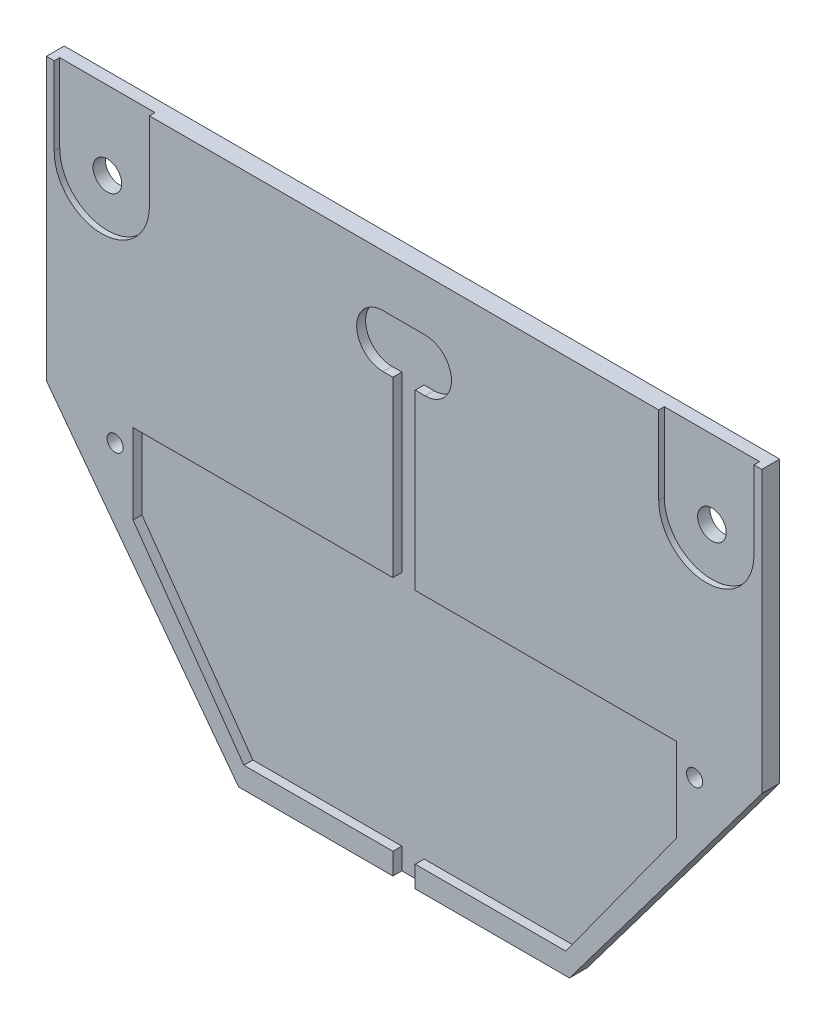
ISO-10303-21;
HEADER;
FILE_DESCRIPTION(('STEP AP214'),'2;1');
FILE_NAME('part.step','',(''),(''),'','','');
FILE_SCHEMA(('AUTOMOTIVE_DESIGN { 1 0 10303 214 1 1 1 1 }'));
ENDSEC;
DATA;
#1=APPLICATION_CONTEXT('core data for automotive mechanical design processes');
#2=APPLICATION_PROTOCOL_DEFINITION('international standard','automotive_design',2000,#1);
#3=PRODUCT_CONTEXT('',#1,'mechanical');
#4=PRODUCT('Part','Part','',(#3));
#5=PRODUCT_RELATED_PRODUCT_CATEGORY('part','',(#4));
#6=PRODUCT_DEFINITION_FORMATION('','',#4);
#7=PRODUCT_DEFINITION_CONTEXT('part definition',#1,'design');
#8=PRODUCT_DEFINITION('design','',#6,#7);
#9=PRODUCT_DEFINITION_SHAPE('','',#8);
#10=(LENGTH_UNIT() NAMED_UNIT(*) SI_UNIT(.MILLI.,.METRE.));
#11=(NAMED_UNIT(*) PLANE_ANGLE_UNIT() SI_UNIT($,.RADIAN.));
#12=(NAMED_UNIT(*) SI_UNIT($,.STERADIAN.) SOLID_ANGLE_UNIT());
#13=UNCERTAINTY_MEASURE_WITH_UNIT(LENGTH_MEASURE(1.E-05),#10,'distance_accuracy_value','');
#14=(GEOMETRIC_REPRESENTATION_CONTEXT(3) GLOBAL_UNCERTAINTY_ASSIGNED_CONTEXT((#13)) GLOBAL_UNIT_ASSIGNED_CONTEXT((#10,
#11,#12)) REPRESENTATION_CONTEXT('',''));
#15=CARTESIAN_POINT('',(0.,0.,0.));
#16=DIRECTION('',(0.,0.,1.));
#17=DIRECTION('',(1.,0.,0.));
#18=AXIS2_PLACEMENT_3D('',#15,#16,#17);
#19=CARTESIAN_POINT('',(101.6,152.4,-5.08));
#20=DIRECTION('',(0.,1.,0.));
#21=DIRECTION('',(0.,0.,1.));
#22=AXIS2_PLACEMENT_3D('',#19,#20,#21);
#23=PLANE('',#22);
#24=DIRECTION('',(1.,0.,0.));
#25=VECTOR('',#24,1.);
#26=CARTESIAN_POINT('',(-99.3775,152.4,-1.5875));
#27=LINE('',#26,#25);
#28=CARTESIAN_POINT('',(-99.3775,152.4,-1.5875));
#29=VERTEX_POINT('',#28);
#30=CARTESIAN_POINT('',(-72.3265,152.4,-1.5875));
#31=VERTEX_POINT('',#30);
#32=EDGE_CURVE('E260',#29,#31,#27,.T.);
#33=ORIENTED_EDGE('',*,*,#32,.T.);
#34=DIRECTION('',(0.,0.,1.));
#35=VECTOR('',#34,1.);
#36=CARTESIAN_POINT('',(-72.3265,152.4,-1.5875));
#37=LINE('',#36,#35);
#38=CARTESIAN_POINT('',(-72.3265,152.4,0.));
#39=VERTEX_POINT('',#38);
#40=EDGE_CURVE('E582',#31,#39,#37,.T.);
#41=ORIENTED_EDGE('',*,*,#40,.T.);
#42=DIRECTION('',(-1.,0.,0.));
#43=VECTOR('',#42,1.);
#44=CARTESIAN_POINT('',(101.6,152.4,0.));
#45=LINE('',#44,#43);
#46=CARTESIAN_POINT('',(72.3265,152.4,0.));
#47=VERTEX_POINT('',#46);
#48=EDGE_CURVE('E489',#47,#39,#45,.T.);
#49=ORIENTED_EDGE('',*,*,#48,.F.);
#50=DIRECTION('',(0.,0.,1.));
#51=VECTOR('',#50,1.);
#52=CARTESIAN_POINT('',(72.3265,152.4,-1.5875));
#53=LINE('',#52,#51);
#54=CARTESIAN_POINT('',(72.3265,152.4,-1.5875));
#55=VERTEX_POINT('',#54);
#56=EDGE_CURVE('E66',#55,#47,#53,.T.);
#57=ORIENTED_EDGE('',*,*,#56,.F.);
#58=DIRECTION('',(-1.,0.,0.));
#59=VECTOR('',#58,1.);
#60=CARTESIAN_POINT('',(99.3775,152.4,-1.5875));
#61=LINE('',#60,#59);
#62=CARTESIAN_POINT('',(99.3775,152.4,-1.5875));
#63=VERTEX_POINT('',#62);
#64=EDGE_CURVE('E280',#63,#55,#61,.T.);
#65=ORIENTED_EDGE('',*,*,#64,.F.);
#66=DIRECTION('',(0.,0.,1.));
#67=VECTOR('',#66,1.);
#68=CARTESIAN_POINT('',(99.3775,152.4,-1.5875));
#69=LINE('',#68,#67);
#70=CARTESIAN_POINT('',(99.3775,152.4,0.));
#71=VERTEX_POINT('',#70);
#72=EDGE_CURVE('E299',#63,#71,#69,.T.);
#73=ORIENTED_EDGE('',*,*,#72,.T.);
#74=CARTESIAN_POINT('',(101.6,152.4,0.));
#75=VERTEX_POINT('',#74);
#76=EDGE_CURVE('E485',#75,#71,#45,.T.);
#77=ORIENTED_EDGE('',*,*,#76,.F.);
#78=DIRECTION('',(0.,0.,1.));
#79=VECTOR('',#78,1.);
#80=CARTESIAN_POINT('',(101.6,152.4,-5.08));
#81=LINE('',#80,#79);
#82=CARTESIAN_POINT('',(101.6,152.4,-5.08));
#83=VERTEX_POINT('',#82);
#84=EDGE_CURVE('E497',#83,#75,#81,.T.);
#85=ORIENTED_EDGE('',*,*,#84,.F.);
#86=DIRECTION('',(-1.,0.,0.));
#87=VECTOR('',#86,1.);
#88=CARTESIAN_POINT('',(101.6,152.4,-5.08));
#89=LINE('',#88,#87);
#90=CARTESIAN_POINT('',(-101.6,152.4,-5.08));
#91=VERTEX_POINT('',#90);
#92=EDGE_CURVE('E466',#83,#91,#89,.T.);
#93=ORIENTED_EDGE('',*,*,#92,.T.);
#94=DIRECTION('',(0.,0.,1.));
#95=VECTOR('',#94,1.);
#96=CARTESIAN_POINT('',(-101.6,152.4,-5.08));
#97=LINE('',#96,#95);
#98=CARTESIAN_POINT('',(-101.6,152.4,0.));
#99=VERTEX_POINT('',#98);
#100=EDGE_CURVE('E495',#91,#99,#97,.T.);
#101=ORIENTED_EDGE('',*,*,#100,.T.);
#102=CARTESIAN_POINT('',(-99.3775,152.4,0.));
#103=VERTEX_POINT('',#102);
#104=EDGE_CURVE('E273',#103,#99,#45,.T.);
#105=ORIENTED_EDGE('',*,*,#104,.F.);
#106=DIRECTION('',(0.,0.,1.));
#107=VECTOR('',#106,1.);
#108=CARTESIAN_POINT('',(-99.3775,152.4,-1.5875));
#109=LINE('',#108,#107);
#110=EDGE_CURVE('E58',#29,#103,#109,.T.);
#111=ORIENTED_EDGE('',*,*,#110,.F.);
#112=EDGE_LOOP('',(#33,#41,#49,#57,#65,#73,#77,#85,#93,#101,#105,#111));
#113=FACE_BOUND('',#112,.T.);
#114=ADVANCED_FACE('F41',(#113),#23,.T.);
#115=CARTESIAN_POINT('',(0.,0.,0.));
#116=DIRECTION('',(0.,0.,1.));
#117=DIRECTION('',(1.,0.,0.));
#118=AXIS2_PLACEMENT_3D('',#115,#116,#117);
#119=PLANE('',#118);
#120=CARTESIAN_POINT('',(-82.0536493943438,67.056,0.));
#121=DIRECTION('',(0.,0.,1.));
#122=DIRECTION('',(1.,0.,0.));
#123=AXIS2_PLACEMENT_3D('',#120,#121,#122);
#124=CIRCLE('',#123,2.28599999999999);
#125=CARTESIAN_POINT('',(-79.7676493943438,67.056,0.));
#126=VERTEX_POINT('',#125);
#127=EDGE_CURVE('E311',#126,#126,#124,.T.);
#128=ORIENTED_EDGE('',*,*,#127,.F.);
#129=EDGE_LOOP('',(#128));
#130=FACE_BOUND('',#129,.T.);
#131=CARTESIAN_POINT('',(82.5187992899213,67.056,0.));
#132=DIRECTION('',(0.,0.,1.));
#133=DIRECTION('',(1.,0.,0.));
#134=AXIS2_PLACEMENT_3D('',#131,#132,#133);
#135=CIRCLE('',#134,2.28599999999999);
#136=CARTESIAN_POINT('',(84.8047992899212,67.056,0.));
#137=VERTEX_POINT('',#136);
#138=EDGE_CURVE('E312',#137,#137,#135,.T.);
#139=ORIENTED_EDGE('',*,*,#138,.F.);
#140=EDGE_LOOP('',(#139));
#141=FACE_BOUND('',#140,.T.);
#142=ORIENTED_EDGE('',*,*,#48,.T.);
#143=DIRECTION('',(0.,-1.,0.));
#144=VECTOR('',#143,1.);
#145=CARTESIAN_POINT('',(-72.3265,152.4,0.));
#146=LINE('',#145,#144);
#147=CARTESIAN_POINT('',(-72.3265,130.175,0.));
#148=VERTEX_POINT('',#147);
#149=EDGE_CURVE('E269',#39,#148,#146,.T.);
#150=ORIENTED_EDGE('',*,*,#149,.T.);
#151=CARTESIAN_POINT('',(-85.852,130.175,0.));
#152=DIRECTION('',(0.,0.,-1.));
#153=DIRECTION('',(-1.,0.,0.));
#154=AXIS2_PLACEMENT_3D('',#151,#152,#153);
#155=CIRCLE('',#154,13.5255);
#156=CARTESIAN_POINT('',(-99.3775,130.175,0.));
#157=VERTEX_POINT('',#156);
#158=EDGE_CURVE('E586',#148,#157,#155,.T.);
#159=ORIENTED_EDGE('',*,*,#158,.T.);
#160=DIRECTION('',(0.,1.,0.));
#161=VECTOR('',#160,1.);
#162=CARTESIAN_POINT('',(-99.3775,130.175,0.));
#163=LINE('',#162,#161);
#164=EDGE_CURVE('E584',#157,#103,#163,.T.);
#165=ORIENTED_EDGE('',*,*,#164,.T.);
#166=ORIENTED_EDGE('',*,*,#104,.T.);
#167=DIRECTION('',(0.,-1.,0.));
#168=VECTOR('',#167,1.);
#169=CARTESIAN_POINT('',(-101.6,152.4,0.));
#170=LINE('',#169,#168);
#171=CARTESIAN_POINT('',(-101.6,72.644,0.));
#172=VERTEX_POINT('',#171);
#173=EDGE_CURVE('E488',#99,#172,#170,.T.);
#174=ORIENTED_EDGE('',*,*,#173,.T.);
#175=DIRECTION('',(0.600893978890442,-0.799328734710077,0.));
#176=VECTOR('',#175,1.);
#177=CARTESIAN_POINT('',(-101.6,72.644,0.));
#178=LINE('',#177,#176);
#179=CARTESIAN_POINT('',(-46.99,0.,0.));
#180=VERTEX_POINT('',#179);
#181=EDGE_CURVE('E460',#172,#180,#178,.T.);
#182=ORIENTED_EDGE('',*,*,#181,.T.);
#183=DIRECTION('',(1.,0.,0.));
#184=VECTOR('',#183,1.);
#185=CARTESIAN_POINT('',(0.,0.,0.));
#186=LINE('',#185,#184);
#187=CARTESIAN_POINT('',(-3.17499999999999,0.,0.));
#188=VERTEX_POINT('',#187);
#189=EDGE_CURVE('E476',#180,#188,#186,.T.);
#190=ORIENTED_EDGE('',*,*,#189,.T.);
#191=DIRECTION('',(0.,-1.,0.));
#192=VECTOR('',#191,1.);
#193=CARTESIAN_POINT('',(-3.175,6.09156177787445,0.));
#194=LINE('',#193,#192);
#195=CARTESIAN_POINT('',(-3.175,6.09156177787445,0.));
#196=VERTEX_POINT('',#195);
#197=EDGE_CURVE('E318',#196,#188,#194,.T.);
#198=ORIENTED_EDGE('',*,*,#197,.F.);
#199=DIRECTION('',(1.,0.,0.));
#200=VECTOR('',#199,1.);
#201=CARTESIAN_POINT('',(45.9525749477887,6.09156177787445,0.));
#202=LINE('',#201,#200);
#203=CARTESIAN_POINT('',(-45.4874250522113,6.09156177787445,0.));
#204=VERTEX_POINT('',#203);
#205=EDGE_CURVE('E386',#204,#196,#202,.T.);
#206=ORIENTED_EDGE('',*,*,#205,.F.);
#207=DIRECTION('',(0.576894703604342,-0.816818523879851,0.));
#208=VECTOR('',#207,1.);
#209=CARTESIAN_POINT('',(-45.4874250522113,6.09156177787445,0.));
#210=LINE('',#209,#208);
#211=CARTESIAN_POINT('',(-76.9736493943438,50.6725418579573,0.));
#212=VERTEX_POINT('',#211);
#213=EDGE_CURVE('E354',#212,#204,#210,.T.);
#214=ORIENTED_EDGE('',*,*,#213,.F.);
#215=DIRECTION('',(0.,-1.,0.));
#216=VECTOR('',#215,1.);
#217=CARTESIAN_POINT('',(-76.9736493943438,50.6725418579573,0.));
#218=LINE('',#217,#216);
#219=CARTESIAN_POINT('',(-76.9736493943438,73.4015617778744,0.));
#220=VERTEX_POINT('',#219);
#221=EDGE_CURVE('E366',#220,#212,#218,.T.);
#222=ORIENTED_EDGE('',*,*,#221,.F.);
#223=DIRECTION('',(-1.,0.,0.));
#224=VECTOR('',#223,1.);
#225=CARTESIAN_POINT('',(-76.9736493943438,73.4015617778744,0.));
#226=LINE('',#225,#224);
#227=CARTESIAN_POINT('',(-3.17499999999999,73.4015617778744,0.));
#228=VERTEX_POINT('',#227);
#229=EDGE_CURVE('E395',#228,#220,#226,.T.);
#230=ORIENTED_EDGE('',*,*,#229,.F.);
#231=DIRECTION('',(0.,-1.,0.));
#232=VECTOR('',#231,1.);
#233=CARTESIAN_POINT('',(-3.175,122.682,0.));
#234=LINE('',#233,#232);
#235=CARTESIAN_POINT('',(-3.175,122.682,0.));
#236=VERTEX_POINT('',#235);
#237=EDGE_CURVE('E335',#236,#228,#234,.T.);
#238=ORIENTED_EDGE('',*,*,#237,.F.);
#239=DIRECTION('',(1.,0.,0.));
#240=VECTOR('',#239,1.);
#241=CARTESIAN_POINT('',(5.969,122.682,0.));
#242=LINE('',#241,#240);
#243=CARTESIAN_POINT('',(-5.96899999999999,122.682,0.));
#244=VERTEX_POINT('',#243);
#245=EDGE_CURVE('E439',#244,#236,#242,.T.);
#246=ORIENTED_EDGE('',*,*,#245,.F.);
#247=CARTESIAN_POINT('',(-5.969,130.175,0.));
#248=DIRECTION('',(0.,0.,1.));
#249=DIRECTION('',(-1.,0.,0.));
#250=AXIS2_PLACEMENT_3D('',#247,#248,#249);
#251=CIRCLE('',#250,7.493);
#252=CARTESIAN_POINT('',(-5.969,137.668,0.));
#253=VERTEX_POINT('',#252);
#254=EDGE_CURVE('E421',#253,#244,#251,.T.);
#255=ORIENTED_EDGE('',*,*,#254,.F.);
#256=DIRECTION('',(-1.,0.,0.));
#257=VECTOR('',#256,1.);
#258=CARTESIAN_POINT('',(-5.969,137.668,0.));
#259=LINE('',#258,#257);
#260=CARTESIAN_POINT('',(5.969,137.668,0.));
#261=VERTEX_POINT('',#260);
#262=EDGE_CURVE('E426',#261,#253,#259,.T.);
#263=ORIENTED_EDGE('',*,*,#262,.F.);
#264=CARTESIAN_POINT('',(5.969,130.175,0.));
#265=DIRECTION('',(0.,0.,1.));
#266=DIRECTION('',(-1.,0.,0.));
#267=AXIS2_PLACEMENT_3D('',#264,#265,#266);
#268=CIRCLE('',#267,7.493);
#269=CARTESIAN_POINT('',(5.96900000000001,122.682,0.));
#270=VERTEX_POINT('',#269);
#271=EDGE_CURVE('E442',#270,#261,#268,.T.);
#272=ORIENTED_EDGE('',*,*,#271,.F.);
#273=CARTESIAN_POINT('',(3.175,122.682,0.));
#274=VERTEX_POINT('',#273);
#275=EDGE_CURVE('E438',#274,#270,#242,.T.);
#276=ORIENTED_EDGE('',*,*,#275,.F.);
#277=DIRECTION('',(0.,1.,0.));
#278=VECTOR('',#277,1.);
#279=CARTESIAN_POINT('',(3.175,122.682,0.));
#280=LINE('',#279,#278);
#281=CARTESIAN_POINT('',(3.17499999999999,73.4015617778744,0.));
#282=VERTEX_POINT('',#281);
#283=EDGE_CURVE('E346',#282,#274,#280,.T.);
#284=ORIENTED_EDGE('',*,*,#283,.F.);
#285=CARTESIAN_POINT('',(77.4387992899213,73.4015617778744,0.));
#286=VERTEX_POINT('',#285);
#287=EDGE_CURVE('E396',#286,#282,#226,.T.);
#288=ORIENTED_EDGE('',*,*,#287,.F.);
#289=DIRECTION('',(0.,1.,0.));
#290=VECTOR('',#289,1.);
#291=CARTESIAN_POINT('',(77.4387992899213,73.4015617778744,0.));
#292=LINE('',#291,#290);
#293=CARTESIAN_POINT('',(77.4387992899213,49.6794379270803,0.));
#294=VERTEX_POINT('',#293);
#295=EDGE_CURVE('E392',#294,#286,#292,.T.);
#296=ORIENTED_EDGE('',*,*,#295,.F.);
#297=DIRECTION('',(0.585565004288222,0.810625453432678,0.));
#298=VECTOR('',#297,1.);
#299=CARTESIAN_POINT('',(77.4387992899213,49.6794379270803,0.));
#300=LINE('',#299,#298);
#301=CARTESIAN_POINT('',(45.9525749477887,6.09156177787445,0.));
#302=VERTEX_POINT('',#301);
#303=EDGE_CURVE('E389',#302,#294,#300,.T.);
#304=ORIENTED_EDGE('',*,*,#303,.F.);
#305=CARTESIAN_POINT('',(3.175,6.09156177787445,0.));
#306=VERTEX_POINT('',#305);
#307=EDGE_CURVE('E385',#306,#302,#202,.T.);
#308=ORIENTED_EDGE('',*,*,#307,.F.);
#309=DIRECTION('',(0.,1.,0.));
#310=VECTOR('',#309,1.);
#311=CARTESIAN_POINT('',(3.175,6.09156177787445,0.));
#312=LINE('',#311,#310);
#313=CARTESIAN_POINT('',(3.17499999999999,0.,0.));
#314=VERTEX_POINT('',#313);
#315=EDGE_CURVE('E325',#314,#306,#312,.T.);
#316=ORIENTED_EDGE('',*,*,#315,.F.);
#317=CARTESIAN_POINT('',(46.99,0.,0.));
#318=VERTEX_POINT('',#317);
#319=EDGE_CURVE('E449',#314,#318,#186,.T.);
#320=ORIENTED_EDGE('',*,*,#319,.T.);
#321=DIRECTION('',(0.600893978890443,0.799328734710077,0.));
#322=VECTOR('',#321,1.);
#323=CARTESIAN_POINT('',(46.99,0.,0.));
#324=LINE('',#323,#322);
#325=CARTESIAN_POINT('',(101.6,72.644,0.));
#326=VERTEX_POINT('',#325);
#327=EDGE_CURVE('E479',#318,#326,#324,.T.);
#328=ORIENTED_EDGE('',*,*,#327,.T.);
#329=DIRECTION('',(0.,1.,0.));
#330=VECTOR('',#329,1.);
#331=CARTESIAN_POINT('',(101.6,72.644,0.));
#332=LINE('',#331,#330);
#333=EDGE_CURVE('E482',#326,#75,#332,.T.);
#334=ORIENTED_EDGE('',*,*,#333,.T.);
#335=ORIENTED_EDGE('',*,*,#76,.T.);
#336=DIRECTION('',(0.,1.,0.));
#337=VECTOR('',#336,1.);
#338=CARTESIAN_POINT('',(99.3775,130.175,0.));
#339=LINE('',#338,#337);
#340=CARTESIAN_POINT('',(99.3775,130.175,0.));
#341=VERTEX_POINT('',#340);
#342=EDGE_CURVE('E284',#341,#71,#339,.T.);
#343=ORIENTED_EDGE('',*,*,#342,.F.);
#344=CARTESIAN_POINT('',(85.852,130.175,0.));
#345=DIRECTION('',(0.,0.,1.));
#346=DIRECTION('',(1.,0.,0.));
#347=AXIS2_PLACEMENT_3D('',#344,#345,#346);
#348=CIRCLE('',#347,13.5255);
#349=CARTESIAN_POINT('',(72.3265,130.175,0.));
#350=VERTEX_POINT('',#349);
#351=EDGE_CURVE('E295',#350,#341,#348,.T.);
#352=ORIENTED_EDGE('',*,*,#351,.F.);
#353=DIRECTION('',(0.,-1.,0.));
#354=VECTOR('',#353,1.);
#355=CARTESIAN_POINT('',(72.3265,152.4,0.));
#356=LINE('',#355,#354);
#357=EDGE_CURVE('E293',#47,#350,#356,.T.);
#358=ORIENTED_EDGE('',*,*,#357,.F.);
#359=EDGE_LOOP('',(#142,#150,#159,#165,#166,#174,#182,#190,#198,#206,#214,#222,#230,#238,#246,
#255,#263,#272,#276,#284,#288,#296,#304,#308,#316,#320,#328,#334,#335,#343,#352,#358));
#360=FACE_BOUND('',#359,.T.);
#361=ADVANCED_FACE('F521',(#130,#141,#360),#119,.T.);
#362=CARTESIAN_POINT('',(-85.852,130.175,-5.08));
#363=DIRECTION('',(0.,0.,1.));
#364=DIRECTION('',(1.,0.,0.));
#365=AXIS2_PLACEMENT_3D('',#362,#363,#364);
#366=CYLINDRICAL_SURFACE('',#365,4.064);
#367=CARTESIAN_POINT('',(-85.852,130.175,-5.08));
#368=DIRECTION('',(0.,0.,1.));
#369=DIRECTION('',(1.,0.,0.));
#370=AXIS2_PLACEMENT_3D('',#367,#368,#369);
#371=CIRCLE('',#370,4.064);
#372=CARTESIAN_POINT('',(-81.788,130.175,-5.08));
#373=VERTEX_POINT('',#372);
#374=EDGE_CURVE('E418',#373,#373,#371,.T.);
#375=ORIENTED_EDGE('',*,*,#374,.F.);
#376=EDGE_LOOP('',(#375));
#377=FACE_BOUND('',#376,.T.);
#378=CARTESIAN_POINT('',(-85.852,130.175,-1.5875));
#379=DIRECTION('',(0.,0.,1.));
#380=DIRECTION('',(1.,0.,0.));
#381=AXIS2_PLACEMENT_3D('',#378,#379,#380);
#382=CIRCLE('',#381,4.064);
#383=CARTESIAN_POINT('',(-81.788,130.175,-1.5875));
#384=VERTEX_POINT('',#383);
#385=EDGE_CURVE('E45',#384,#384,#382,.F.);
#386=ORIENTED_EDGE('',*,*,#385,.F.);
#387=EDGE_LOOP('',(#386));
#388=FACE_BOUND('',#387,.T.);
#389=ADVANCED_FACE('F510',(#377,#388),#366,.F.);
#390=CARTESIAN_POINT('',(85.852,130.175,-5.08));
#391=DIRECTION('',(0.,0.,1.));
#392=DIRECTION('',(1.,0.,0.));
#393=AXIS2_PLACEMENT_3D('',#390,#391,#392);
#394=CYLINDRICAL_SURFACE('',#393,4.064);
#395=CARTESIAN_POINT('',(85.852,130.175,-5.08));
#396=DIRECTION('',(0.,0.,1.));
#397=DIRECTION('',(1.,0.,0.));
#398=AXIS2_PLACEMENT_3D('',#395,#396,#397);
#399=CIRCLE('',#398,4.064);
#400=CARTESIAN_POINT('',(89.916,130.175,-5.08));
#401=VERTEX_POINT('',#400);
#402=EDGE_CURVE('E403',#401,#401,#399,.T.);
#403=ORIENTED_EDGE('',*,*,#402,.F.);
#404=EDGE_LOOP('',(#403));
#405=FACE_BOUND('',#404,.T.);
#406=CARTESIAN_POINT('',(85.852,130.175,-1.5875));
#407=DIRECTION('',(0.,0.,1.));
#408=DIRECTION('',(1.,0.,0.));
#409=AXIS2_PLACEMENT_3D('',#406,#407,#408);
#410=CIRCLE('',#409,4.064);
#411=CARTESIAN_POINT('',(89.916,130.175,-1.5875));
#412=VERTEX_POINT('',#411);
#413=EDGE_CURVE('E302',#412,#412,#410,.F.);
#414=ORIENTED_EDGE('',*,*,#413,.F.);
#415=EDGE_LOOP('',(#414));
#416=FACE_BOUND('',#415,.T.);
#417=ADVANCED_FACE('F507',(#405,#416),#394,.F.);
#418=CARTESIAN_POINT('',(45.9525749477887,6.09156177787445,-2.54));
#419=DIRECTION('',(0.,-1.,0.));
#420=DIRECTION('',(0.,0.,-1.));
#421=AXIS2_PLACEMENT_3D('',#418,#419,#420);
#422=PLANE('',#421);
#423=ORIENTED_EDGE('',*,*,#205,.T.);
#424=DIRECTION('',(0.,0.,1.));
#425=VECTOR('',#424,1.);
#426=CARTESIAN_POINT('',(-3.175,6.09156177787445,-2.54));
#427=LINE('',#426,#425);
#428=CARTESIAN_POINT('',(-3.175,6.09156177787445,-2.54));
#429=VERTEX_POINT('',#428);
#430=EDGE_CURVE('E333',#429,#196,#427,.T.);
#431=ORIENTED_EDGE('',*,*,#430,.F.);
#432=DIRECTION('',(1.,0.,0.));
#433=VECTOR('',#432,1.);
#434=CARTESIAN_POINT('',(45.9525749477887,6.09156177787445,-2.54));
#435=LINE('',#434,#433);
#436=CARTESIAN_POINT('',(-45.4874250522113,6.09156177787445,-2.54));
#437=VERTEX_POINT('',#436);
#438=EDGE_CURVE('E367',#437,#429,#435,.T.);
#439=ORIENTED_EDGE('',*,*,#438,.F.);
#440=DIRECTION('',(0.,0.,1.));
#441=VECTOR('',#440,1.);
#442=CARTESIAN_POINT('',(-45.4874250522113,6.09156177787445,-2.54));
#443=LINE('',#442,#441);
#444=EDGE_CURVE('E383',#437,#204,#443,.T.);
#445=ORIENTED_EDGE('',*,*,#444,.T.);
#446=EDGE_LOOP('',(#423,#431,#439,#445));
#447=FACE_BOUND('',#446,.T.);
#448=ADVANCED_FACE('F509',(#447),#422,.F.);
#449=CARTESIAN_POINT('',(5.969,122.682,-2.54));
#450=DIRECTION('',(0.,-1.,0.));
#451=DIRECTION('',(0.,0.,-1.));
#452=AXIS2_PLACEMENT_3D('',#449,#450,#451);
#453=PLANE('',#452);
#454=ORIENTED_EDGE('',*,*,#245,.T.);
#455=DIRECTION('',(0.,0.,1.));
#456=VECTOR('',#455,1.);
#457=CARTESIAN_POINT('',(-3.175,122.682,-2.54));
#458=LINE('',#457,#456);
#459=CARTESIAN_POINT('',(-3.175,122.682,-2.54));
#460=VERTEX_POINT('',#459);
#461=EDGE_CURVE('E352',#460,#236,#458,.T.);
#462=ORIENTED_EDGE('',*,*,#461,.F.);
#463=DIRECTION('',(1.,0.,0.));
#464=VECTOR('',#463,1.);
#465=CARTESIAN_POINT('',(5.969,122.682,-2.54));
#466=LINE('',#465,#464);
#467=CARTESIAN_POINT('',(-5.96899999999999,122.682,-2.54));
#468=VERTEX_POINT('',#467);
#469=EDGE_CURVE('E427',#468,#460,#466,.T.);
#470=ORIENTED_EDGE('',*,*,#469,.F.);
#471=DIRECTION('',(0.,0.,1.));
#472=VECTOR('',#471,1.);
#473=CARTESIAN_POINT('',(-5.96899999999999,122.682,-2.54));
#474=LINE('',#473,#472);
#475=EDGE_CURVE('E436',#468,#244,#474,.T.);
#476=ORIENTED_EDGE('',*,*,#475,.T.);
#477=EDGE_LOOP('',(#454,#462,#470,#476));
#478=FACE_BOUND('',#477,.T.);
#479=ADVANCED_FACE('F517',(#478),#453,.F.);
#480=CARTESIAN_POINT('',(-76.9736493943438,73.4015617778744,-2.54));
#481=DIRECTION('',(0.,1.,0.));
#482=DIRECTION('',(0.,0.,1.));
#483=AXIS2_PLACEMENT_3D('',#480,#481,#482);
#484=PLANE('',#483);
#485=DIRECTION('',(-1.,0.,0.));
#486=VECTOR('',#485,1.);
#487=CARTESIAN_POINT('',(-76.9736493943438,73.4015617778744,-2.54));
#488=LINE('',#487,#486);
#489=CARTESIAN_POINT('',(-3.175,73.4015617778744,-2.54));
#490=VERTEX_POINT('',#489);
#491=CARTESIAN_POINT('',(-76.9736493943438,73.4015617778744,-2.54));
#492=VERTEX_POINT('',#491);
#493=EDGE_CURVE('E376',#490,#492,#488,.T.);
#494=ORIENTED_EDGE('',*,*,#493,.F.);
#495=DIRECTION('',(0.,0.,1.));
#496=VECTOR('',#495,1.);
#497=CARTESIAN_POINT('',(-3.17499999999999,73.4015617778744,-2.54));
#498=LINE('',#497,#496);
#499=EDGE_CURVE('E349',#490,#228,#498,.T.);
#500=ORIENTED_EDGE('',*,*,#499,.T.);
#501=ORIENTED_EDGE('',*,*,#229,.T.);
#502=DIRECTION('',(0.,0.,1.));
#503=VECTOR('',#502,1.);
#504=CARTESIAN_POINT('',(-76.9736493943438,73.4015617778744,-2.54));
#505=LINE('',#504,#503);
#506=EDGE_CURVE('E404',#492,#220,#505,.T.);
#507=ORIENTED_EDGE('',*,*,#506,.F.);
#508=EDGE_LOOP('',(#494,#500,#501,#507));
#509=FACE_BOUND('',#508,.T.);
#510=ADVANCED_FACE('F650',(#509),#484,.F.);
#511=CARTESIAN_POINT('',(-101.6,72.644,-5.08));
#512=DIRECTION('',(-0.799328734710077,-0.600893978890442,0.));
#513=DIRECTION('',(0.600893978890442,-0.799328734710077,0.));
#514=AXIS2_PLACEMENT_3D('',#511,#512,#513);
#515=PLANE('',#514);
#516=ORIENTED_EDGE('',*,*,#181,.F.);
#517=DIRECTION('',(0.,0.,1.));
#518=VECTOR('',#517,1.);
#519=CARTESIAN_POINT('',(-101.6,72.644,-5.08));
#520=LINE('',#519,#518);
#521=CARTESIAN_POINT('',(-101.6,72.644,-5.08));
#522=VERTEX_POINT('',#521);
#523=EDGE_CURVE('E50',#522,#172,#520,.T.);
#524=ORIENTED_EDGE('',*,*,#523,.F.);
#525=DIRECTION('',(0.600893978890442,-0.799328734710077,0.));
#526=VECTOR('',#525,1.);
#527=CARTESIAN_POINT('',(-101.6,72.644,-5.08));
#528=LINE('',#527,#526);
#529=CARTESIAN_POINT('',(-46.99,0.,-5.08));
#530=VERTEX_POINT('',#529);
#531=EDGE_CURVE('E472',#522,#530,#528,.T.);
#532=ORIENTED_EDGE('',*,*,#531,.T.);
#533=DIRECTION('',(0.,0.,1.));
#534=VECTOR('',#533,1.);
#535=CARTESIAN_POINT('',(-46.99,0.,-5.08));
#536=LINE('',#535,#534);
#537=EDGE_CURVE('E11',#530,#180,#536,.T.);
#538=ORIENTED_EDGE('',*,*,#537,.T.);
#539=EDGE_LOOP('',(#516,#524,#532,#538));
#540=FACE_BOUND('',#539,.T.);
#541=ADVANCED_FACE('F565',(#540),#515,.T.);
#542=CARTESIAN_POINT('',(-101.6,152.4,-5.08));
#543=DIRECTION('',(-1.,0.,0.));
#544=DIRECTION('',(0.,-1.,0.));
#545=AXIS2_PLACEMENT_3D('',#542,#543,#544);
#546=PLANE('',#545);
#547=ORIENTED_EDGE('',*,*,#173,.F.);
#548=ORIENTED_EDGE('',*,*,#100,.F.);
#549=DIRECTION('',(0.,-1.,0.));
#550=VECTOR('',#549,1.);
#551=CARTESIAN_POINT('',(-101.6,152.4,-5.08));
#552=LINE('',#551,#550);
#553=EDGE_CURVE('E469',#91,#522,#552,.T.);
#554=ORIENTED_EDGE('',*,*,#553,.T.);
#555=ORIENTED_EDGE('',*,*,#523,.T.);
#556=EDGE_LOOP('',(#547,#548,#554,#555));
#557=FACE_BOUND('',#556,.T.);
#558=ADVANCED_FACE('F535',(#557),#546,.T.);
#559=CARTESIAN_POINT('',(101.6,72.644,-5.08));
#560=DIRECTION('',(1.,0.,0.));
#561=DIRECTION('',(0.,0.,-1.));
#562=AXIS2_PLACEMENT_3D('',#559,#560,#561);
#563=PLANE('',#562);
#564=ORIENTED_EDGE('',*,*,#333,.F.);
#565=DIRECTION('',(0.,0.,1.));
#566=VECTOR('',#565,1.);
#567=CARTESIAN_POINT('',(101.6,72.644,-5.08));
#568=LINE('',#567,#566);
#569=CARTESIAN_POINT('',(101.6,72.644,-5.08));
#570=VERTEX_POINT('',#569);
#571=EDGE_CURVE('E499',#570,#326,#568,.T.);
#572=ORIENTED_EDGE('',*,*,#571,.F.);
#573=DIRECTION('',(0.,1.,0.));
#574=VECTOR('',#573,1.);
#575=CARTESIAN_POINT('',(101.6,72.644,-5.08));
#576=LINE('',#575,#574);
#577=EDGE_CURVE('E463',#570,#83,#576,.T.);
#578=ORIENTED_EDGE('',*,*,#577,.T.);
#579=ORIENTED_EDGE('',*,*,#84,.T.);
#580=EDGE_LOOP('',(#564,#572,#578,#579));
#581=FACE_BOUND('',#580,.T.);
#582=ADVANCED_FACE('F537',(#581),#563,.T.);
#583=CARTESIAN_POINT('',(46.99,0.,-5.08));
#584=DIRECTION('',(0.799328734710077,-0.600893978890443,0.));
#585=DIRECTION('',(0.600893978890443,0.799328734710077,0.));
#586=AXIS2_PLACEMENT_3D('',#583,#584,#585);
#587=PLANE('',#586);
#588=ORIENTED_EDGE('',*,*,#327,.F.);
#589=DIRECTION('',(0.,0.,1.));
#590=VECTOR('',#589,1.);
#591=CARTESIAN_POINT('',(46.99,0.,-5.08));
#592=LINE('',#591,#590);
#593=CARTESIAN_POINT('',(46.99,0.,-5.08));
#594=VERTEX_POINT('',#593);
#595=EDGE_CURVE('E475',#594,#318,#592,.T.);
#596=ORIENTED_EDGE('',*,*,#595,.F.);
#597=DIRECTION('',(0.600893978890443,0.799328734710077,0.));
#598=VECTOR('',#597,1.);
#599=CARTESIAN_POINT('',(46.99,0.,-5.08));
#600=LINE('',#599,#598);
#601=EDGE_CURVE('E459',#594,#570,#600,.T.);
#602=ORIENTED_EDGE('',*,*,#601,.T.);
#603=ORIENTED_EDGE('',*,*,#571,.T.);
#604=EDGE_LOOP('',(#588,#596,#602,#603));
#605=FACE_BOUND('',#604,.T.);
#606=ADVANCED_FACE('F539',(#605),#587,.T.);
#607=CARTESIAN_POINT('',(0.,0.,-5.08));
#608=DIRECTION('',(0.,-1.,0.));
#609=DIRECTION('',(0.,0.,-1.));
#610=AXIS2_PLACEMENT_3D('',#607,#608,#609);
#611=PLANE('',#610);
#612=DIRECTION('',(0.,0.,1.));
#613=VECTOR('',#612,1.);
#614=CARTESIAN_POINT('',(-3.17499999999999,0.,-2.54));
#615=LINE('',#614,#613);
#616=CARTESIAN_POINT('',(-3.17499999999999,0.,-2.54));
#617=VERTEX_POINT('',#616);
#618=EDGE_CURVE('E330',#617,#188,#615,.T.);
#619=ORIENTED_EDGE('',*,*,#618,.T.);
#620=ORIENTED_EDGE('',*,*,#189,.F.);
#621=ORIENTED_EDGE('',*,*,#537,.F.);
#622=DIRECTION('',(1.,0.,0.));
#623=VECTOR('',#622,1.);
#624=CARTESIAN_POINT('',(-46.99,0.,-5.08));
#625=LINE('',#624,#623);
#626=EDGE_CURVE('E457',#530,#594,#625,.T.);
#627=ORIENTED_EDGE('',*,*,#626,.T.);
#628=ORIENTED_EDGE('',*,*,#595,.T.);
#629=ORIENTED_EDGE('',*,*,#319,.F.);
#630=DIRECTION('',(0.,0.,1.));
#631=VECTOR('',#630,1.);
#632=CARTESIAN_POINT('',(3.17499999999999,0.,-2.54));
#633=LINE('',#632,#631);
#634=CARTESIAN_POINT('',(3.17499999999999,0.,-2.54));
#635=VERTEX_POINT('',#634);
#636=EDGE_CURVE('E339',#635,#314,#633,.T.);
#637=ORIENTED_EDGE('',*,*,#636,.F.);
#638=DIRECTION('',(1.,0.,0.));
#639=VECTOR('',#638,1.);
#640=CARTESIAN_POINT('',(-3.17499999999999,0.,-2.54));
#641=LINE('',#640,#639);
#642=EDGE_CURVE('E324',#617,#635,#641,.T.);
#643=ORIENTED_EDGE('',*,*,#642,.F.);
#644=EDGE_LOOP('',(#619,#620,#621,#627,#628,#629,#637,#643));
#645=FACE_BOUND('',#644,.T.);
#646=ADVANCED_FACE('F43',(#645),#611,.T.);
#647=CARTESIAN_POINT('',(0.,0.,-5.08));
#648=DIRECTION('',(0.,0.,1.));
#649=DIRECTION('',(1.,0.,0.));
#650=AXIS2_PLACEMENT_3D('',#647,#648,#649);
#651=PLANE('',#650);
#652=CARTESIAN_POINT('',(82.5187992899213,67.056,-5.08));
#653=DIRECTION('',(0.,0.,1.));
#654=DIRECTION('',(1.,0.,0.));
#655=AXIS2_PLACEMENT_3D('',#652,#653,#654);
#656=CIRCLE('',#655,2.28599999999999);
#657=CARTESIAN_POINT('',(84.8047992899212,67.056,-5.08));
#658=VERTEX_POINT('',#657);
#659=EDGE_CURVE('E308',#658,#658,#656,.T.);
#660=ORIENTED_EDGE('',*,*,#659,.T.);
#661=EDGE_LOOP('',(#660));
#662=FACE_BOUND('',#661,.T.);
#663=CARTESIAN_POINT('',(-82.0536493943438,67.056,-5.08));
#664=DIRECTION('',(0.,0.,1.));
#665=DIRECTION('',(1.,0.,0.));
#666=AXIS2_PLACEMENT_3D('',#663,#664,#665);
#667=CIRCLE('',#666,2.28599999999999);
#668=CARTESIAN_POINT('',(-79.7676493943438,67.056,-5.08));
#669=VERTEX_POINT('',#668);
#670=EDGE_CURVE('E315',#669,#669,#667,.T.);
#671=ORIENTED_EDGE('',*,*,#670,.T.);
#672=EDGE_LOOP('',(#671));
#673=FACE_BOUND('',#672,.T.);
#674=ORIENTED_EDGE('',*,*,#402,.T.);
#675=EDGE_LOOP('',(#674));
#676=FACE_BOUND('',#675,.T.);
#677=ORIENTED_EDGE('',*,*,#374,.T.);
#678=EDGE_LOOP('',(#677));
#679=FACE_BOUND('',#678,.T.);
#680=ORIENTED_EDGE('',*,*,#626,.F.);
#681=ORIENTED_EDGE('',*,*,#531,.F.);
#682=ORIENTED_EDGE('',*,*,#553,.F.);
#683=ORIENTED_EDGE('',*,*,#92,.F.);
#684=ORIENTED_EDGE('',*,*,#577,.F.);
#685=ORIENTED_EDGE('',*,*,#601,.F.);
#686=EDGE_LOOP('',(#680,#681,#682,#683,#684,#685));
#687=FACE_BOUND('',#686,.T.);
#688=ADVANCED_FACE('F546',(#662,#673,#676,#679,#687),#651,.F.);
#689=CARTESIAN_POINT('',(-5.969,130.175,-2.54));
#690=DIRECTION('',(0.,0.,1.));
#691=DIRECTION('',(1.,0.,0.));
#692=AXIS2_PLACEMENT_3D('',#689,#690,#691);
#693=CYLINDRICAL_SURFACE('',#692,7.493);
#694=ORIENTED_EDGE('',*,*,#254,.T.);
#695=ORIENTED_EDGE('',*,*,#475,.F.);
#696=CARTESIAN_POINT('',(-5.969,130.175,-2.54));
#697=DIRECTION('',(0.,0.,1.));
#698=DIRECTION('',(-1.,0.,0.));
#699=AXIS2_PLACEMENT_3D('',#696,#697,#698);
#700=CIRCLE('',#699,7.493);
#701=CARTESIAN_POINT('',(-5.969,137.668,-2.54));
#702=VERTEX_POINT('',#701);
#703=EDGE_CURVE('E422',#702,#468,#700,.T.);
#704=ORIENTED_EDGE('',*,*,#703,.F.);
#705=DIRECTION('',(0.,0.,1.));
#706=VECTOR('',#705,1.);
#707=CARTESIAN_POINT('',(-5.969,137.668,-2.54));
#708=LINE('',#707,#706);
#709=EDGE_CURVE('E447',#702,#253,#708,.T.);
#710=ORIENTED_EDGE('',*,*,#709,.T.);
#711=EDGE_LOOP('',(#694,#695,#704,#710));
#712=FACE_BOUND('',#711,.T.);
#713=ADVANCED_FACE('F691',(#712),#693,.F.);
#714=CARTESIAN_POINT('',(-5.969,137.668,-2.54));
#715=DIRECTION('',(0.,1.,0.));
#716=DIRECTION('',(0.,0.,1.));
#717=AXIS2_PLACEMENT_3D('',#714,#715,#716);
#718=PLANE('',#717);
#719=ORIENTED_EDGE('',*,*,#262,.T.);
#720=ORIENTED_EDGE('',*,*,#709,.F.);
#721=DIRECTION('',(-1.,0.,0.));
#722=VECTOR('',#721,1.);
#723=CARTESIAN_POINT('',(-5.969,137.668,-2.54));
#724=LINE('',#723,#722);
#725=CARTESIAN_POINT('',(5.969,137.668,-2.54));
#726=VERTEX_POINT('',#725);
#727=EDGE_CURVE('E433',#726,#702,#724,.T.);
#728=ORIENTED_EDGE('',*,*,#727,.F.);
#729=DIRECTION('',(0.,0.,1.));
#730=VECTOR('',#729,1.);
#731=CARTESIAN_POINT('',(5.969,137.668,-2.54));
#732=LINE('',#731,#730);
#733=EDGE_CURVE('E450',#726,#261,#732,.T.);
#734=ORIENTED_EDGE('',*,*,#733,.T.);
#735=EDGE_LOOP('',(#719,#720,#728,#734));
#736=FACE_BOUND('',#735,.T.);
#737=ADVANCED_FACE('F697',(#736),#718,.F.);
#738=CARTESIAN_POINT('',(5.969,130.175,-2.54));
#739=DIRECTION('',(0.,0.,1.));
#740=DIRECTION('',(1.,0.,0.));
#741=AXIS2_PLACEMENT_3D('',#738,#739,#740);
#742=CYLINDRICAL_SURFACE('',#741,7.493);
#743=ORIENTED_EDGE('',*,*,#271,.T.);
#744=ORIENTED_EDGE('',*,*,#733,.F.);
#745=CARTESIAN_POINT('',(5.969,130.175,-2.54));
#746=DIRECTION('',(0.,0.,1.));
#747=DIRECTION('',(-1.,0.,0.));
#748=AXIS2_PLACEMENT_3D('',#745,#746,#747);
#749=CIRCLE('',#748,7.493);
#750=CARTESIAN_POINT('',(5.96900000000001,122.682,-2.54));
#751=VERTEX_POINT('',#750);
#752=EDGE_CURVE('E430',#751,#726,#749,.T.);
#753=ORIENTED_EDGE('',*,*,#752,.F.);
#754=DIRECTION('',(0.,0.,1.));
#755=VECTOR('',#754,1.);
#756=CARTESIAN_POINT('',(5.96900000000001,122.682,-2.54));
#757=LINE('',#756,#755);
#758=EDGE_CURVE('E452',#751,#270,#757,.T.);
#759=ORIENTED_EDGE('',*,*,#758,.T.);
#760=EDGE_LOOP('',(#743,#744,#753,#759));
#761=FACE_BOUND('',#760,.T.);
#762=ADVANCED_FACE('F700',(#761),#742,.F.);
#763=CARTESIAN_POINT('',(3.175,122.682,-2.54));
#764=VERTEX_POINT('',#763);
#765=EDGE_CURVE('E425',#764,#751,#466,.T.);
#766=ORIENTED_EDGE('',*,*,#765,.F.);
#767=DIRECTION('',(0.,0.,1.));
#768=VECTOR('',#767,1.);
#769=CARTESIAN_POINT('',(3.175,122.682,-2.54));
#770=LINE('',#769,#768);
#771=EDGE_CURVE('E355',#764,#274,#770,.T.);
#772=ORIENTED_EDGE('',*,*,#771,.T.);
#773=ORIENTED_EDGE('',*,*,#275,.T.);
#774=ORIENTED_EDGE('',*,*,#758,.F.);
#775=EDGE_LOOP('',(#766,#772,#773,#774));
#776=FACE_BOUND('',#775,.T.);
#777=ADVANCED_FACE('F665',(#776),#453,.F.);
#778=CARTESIAN_POINT('',(-5.969,130.175,-2.54));
#779=DIRECTION('',(0.,0.,-1.));
#780=DIRECTION('',(-1.,0.,0.));
#781=AXIS2_PLACEMENT_3D('',#778,#779,#780);
#782=PLANE('',#781);
#783=ORIENTED_EDGE('',*,*,#703,.T.);
#784=ORIENTED_EDGE('',*,*,#469,.T.);
#785=DIRECTION('',(0.,-1.,0.));
#786=VECTOR('',#785,1.);
#787=CARTESIAN_POINT('',(-3.175,122.682,-2.54));
#788=LINE('',#787,#786);
#789=EDGE_CURVE('E343',#460,#490,#788,.T.);
#790=ORIENTED_EDGE('',*,*,#789,.T.);
#791=ORIENTED_EDGE('',*,*,#493,.T.);
#792=DIRECTION('',(0.,-1.,0.));
#793=VECTOR('',#792,1.);
#794=CARTESIAN_POINT('',(-76.9736493943438,50.6725418579573,-2.54));
#795=LINE('',#794,#793);
#796=CARTESIAN_POINT('',(-76.9736493943438,50.6725418579573,-2.54));
#797=VERTEX_POINT('',#796);
#798=EDGE_CURVE('E380',#492,#797,#795,.T.);
#799=ORIENTED_EDGE('',*,*,#798,.T.);
#800=DIRECTION('',(0.576894703604342,-0.816818523879851,0.));
#801=VECTOR('',#800,1.);
#802=CARTESIAN_POINT('',(-45.4874250522113,6.09156177787445,-2.54));
#803=LINE('',#802,#801);
#804=EDGE_CURVE('E362',#797,#437,#803,.T.);
#805=ORIENTED_EDGE('',*,*,#804,.T.);
#806=ORIENTED_EDGE('',*,*,#438,.T.);
#807=DIRECTION('',(0.,-1.,0.));
#808=VECTOR('',#807,1.);
#809=CARTESIAN_POINT('',(-3.175,6.09156177787445,-2.54));
#810=LINE('',#809,#808);
#811=EDGE_CURVE('E321',#429,#617,#810,.T.);
#812=ORIENTED_EDGE('',*,*,#811,.T.);
#813=ORIENTED_EDGE('',*,*,#642,.T.);
#814=DIRECTION('',(0.,1.,0.));
#815=VECTOR('',#814,1.);
#816=CARTESIAN_POINT('',(3.175,6.09156177787445,-2.54));
#817=LINE('',#816,#815);
#818=CARTESIAN_POINT('',(3.175,6.09156177787445,-2.54));
#819=VERTEX_POINT('',#818);
#820=EDGE_CURVE('E328',#635,#819,#817,.T.);
#821=ORIENTED_EDGE('',*,*,#820,.T.);
#822=CARTESIAN_POINT('',(45.9525749477887,6.09156177787445,-2.54));
#823=VERTEX_POINT('',#822);
#824=EDGE_CURVE('E365',#819,#823,#435,.T.);
#825=ORIENTED_EDGE('',*,*,#824,.T.);
#826=DIRECTION('',(0.585565004288222,0.810625453432678,0.));
#827=VECTOR('',#826,1.);
#828=CARTESIAN_POINT('',(77.4387992899213,49.6794379270803,-2.54));
#829=LINE('',#828,#827);
#830=CARTESIAN_POINT('',(77.4387992899213,49.6794379270803,-2.54));
#831=VERTEX_POINT('',#830);
#832=EDGE_CURVE('E370',#823,#831,#829,.T.);
#833=ORIENTED_EDGE('',*,*,#832,.T.);
#834=DIRECTION('',(0.,1.,0.));
#835=VECTOR('',#834,1.);
#836=CARTESIAN_POINT('',(77.4387992899213,73.4015617778744,-2.54));
#837=LINE('',#836,#835);
#838=CARTESIAN_POINT('',(77.4387992899213,73.4015617778744,-2.54));
#839=VERTEX_POINT('',#838);
#840=EDGE_CURVE('E373',#831,#839,#837,.T.);
#841=ORIENTED_EDGE('',*,*,#840,.T.);
#842=CARTESIAN_POINT('',(3.17499999999999,73.4015617778744,-2.54));
#843=VERTEX_POINT('',#842);
#844=EDGE_CURVE('E377',#839,#843,#488,.T.);
#845=ORIENTED_EDGE('',*,*,#844,.T.);
#846=DIRECTION('',(0.,1.,0.));
#847=VECTOR('',#846,1.);
#848=CARTESIAN_POINT('',(3.175,122.682,-2.54));
#849=LINE('',#848,#847);
#850=EDGE_CURVE('E345',#843,#764,#849,.T.);
#851=ORIENTED_EDGE('',*,*,#850,.T.);
#852=ORIENTED_EDGE('',*,*,#765,.T.);
#853=ORIENTED_EDGE('',*,*,#752,.T.);
#854=ORIENTED_EDGE('',*,*,#727,.T.);
#855=EDGE_LOOP('',(#783,#784,#790,#791,#799,#805,#806,#812,#813,#821,#825,#833,#841,#845,#851,
#852,#853,#854));
#856=FACE_BOUND('',#855,.T.);
#857=ADVANCED_FACE('F660',(#856),#782,.F.);
#858=CARTESIAN_POINT('',(-45.4874250522113,6.09156177787445,-2.54));
#859=DIRECTION('',(-0.816818523879851,-0.576894703604342,0.));
#860=DIRECTION('',(0.576894703604342,-0.816818523879851,0.));
#861=AXIS2_PLACEMENT_3D('',#858,#859,#860);
#862=PLANE('',#861);
#863=ORIENTED_EDGE('',*,*,#213,.T.);
#864=ORIENTED_EDGE('',*,*,#444,.F.);
#865=ORIENTED_EDGE('',*,*,#804,.F.);
#866=DIRECTION('',(0.,0.,1.));
#867=VECTOR('',#866,1.);
#868=CARTESIAN_POINT('',(-76.9736493943438,50.6725418579573,-2.54));
#869=LINE('',#868,#867);
#870=EDGE_CURVE('E401',#797,#212,#869,.T.);
#871=ORIENTED_EDGE('',*,*,#870,.T.);
#872=EDGE_LOOP('',(#863,#864,#865,#871));
#873=FACE_BOUND('',#872,.T.);
#874=ADVANCED_FACE('F644',(#873),#862,.F.);
#875=CARTESIAN_POINT('',(-76.9736493943438,50.6725418579573,-2.54));
#876=DIRECTION('',(-1.,0.,0.));
#877=DIRECTION('',(0.,0.,1.));
#878=AXIS2_PLACEMENT_3D('',#875,#876,#877);
#879=PLANE('',#878);
#880=ORIENTED_EDGE('',*,*,#221,.T.);
#881=ORIENTED_EDGE('',*,*,#870,.F.);
#882=ORIENTED_EDGE('',*,*,#798,.F.);
#883=ORIENTED_EDGE('',*,*,#506,.T.);
#884=EDGE_LOOP('',(#880,#881,#882,#883));
#885=FACE_BOUND('',#884,.T.);
#886=ADVANCED_FACE('F640',(#885),#879,.F.);
#887=ORIENTED_EDGE('',*,*,#287,.T.);
#888=DIRECTION('',(0.,0.,1.));
#889=VECTOR('',#888,1.);
#890=CARTESIAN_POINT('',(3.17499999999999,73.4015617778744,-2.54));
#891=LINE('',#890,#889);
#892=EDGE_CURVE('E358',#843,#282,#891,.T.);
#893=ORIENTED_EDGE('',*,*,#892,.F.);
#894=ORIENTED_EDGE('',*,*,#844,.F.);
#895=DIRECTION('',(0.,0.,1.));
#896=VECTOR('',#895,1.);
#897=CARTESIAN_POINT('',(77.4387992899213,73.4015617778744,-2.54));
#898=LINE('',#897,#896);
#899=EDGE_CURVE('E407',#839,#286,#898,.T.);
#900=ORIENTED_EDGE('',*,*,#899,.T.);
#901=EDGE_LOOP('',(#887,#893,#894,#900));
#902=FACE_BOUND('',#901,.T.);
#903=ADVANCED_FACE('F643',(#902),#484,.F.);
#904=CARTESIAN_POINT('',(77.4387992899213,73.4015617778744,-2.54));
#905=DIRECTION('',(1.,0.,0.));
#906=DIRECTION('',(0.,0.,-1.));
#907=AXIS2_PLACEMENT_3D('',#904,#905,#906);
#908=PLANE('',#907);
#909=ORIENTED_EDGE('',*,*,#295,.T.);
#910=ORIENTED_EDGE('',*,*,#899,.F.);
#911=ORIENTED_EDGE('',*,*,#840,.F.);
#912=DIRECTION('',(0.,0.,1.));
#913=VECTOR('',#912,1.);
#914=CARTESIAN_POINT('',(77.4387992899213,49.6794379270803,-2.54));
#915=LINE('',#914,#913);
#916=EDGE_CURVE('E409',#831,#294,#915,.T.);
#917=ORIENTED_EDGE('',*,*,#916,.T.);
#918=EDGE_LOOP('',(#909,#910,#911,#917));
#919=FACE_BOUND('',#918,.T.);
#920=ADVANCED_FACE('F648',(#919),#908,.F.);
#921=CARTESIAN_POINT('',(77.4387992899213,49.6794379270803,-2.54));
#922=DIRECTION('',(0.810625453432678,-0.585565004288222,0.));
#923=DIRECTION('',(0.585565004288222,0.810625453432678,0.));
#924=AXIS2_PLACEMENT_3D('',#921,#922,#923);
#925=PLANE('',#924);
#926=ORIENTED_EDGE('',*,*,#303,.T.);
#927=ORIENTED_EDGE('',*,*,#916,.F.);
#928=ORIENTED_EDGE('',*,*,#832,.F.);
#929=DIRECTION('',(0.,0.,1.));
#930=VECTOR('',#929,1.);
#931=CARTESIAN_POINT('',(45.9525749477887,6.09156177787445,-2.54));
#932=LINE('',#931,#930);
#933=EDGE_CURVE('E411',#823,#302,#932,.T.);
#934=ORIENTED_EDGE('',*,*,#933,.T.);
#935=EDGE_LOOP('',(#926,#927,#928,#934));
#936=FACE_BOUND('',#935,.T.);
#937=ADVANCED_FACE('F653',(#936),#925,.F.);
#938=ORIENTED_EDGE('',*,*,#824,.F.);
#939=DIRECTION('',(0.,0.,1.));
#940=VECTOR('',#939,1.);
#941=CARTESIAN_POINT('',(3.175,6.09156177787445,-2.54));
#942=LINE('',#941,#940);
#943=EDGE_CURVE('E336',#819,#306,#942,.T.);
#944=ORIENTED_EDGE('',*,*,#943,.T.);
#945=ORIENTED_EDGE('',*,*,#307,.T.);
#946=ORIENTED_EDGE('',*,*,#933,.F.);
#947=EDGE_LOOP('',(#938,#944,#945,#946));
#948=FACE_BOUND('',#947,.T.);
#949=ADVANCED_FACE('F520',(#948),#422,.F.);
#950=CARTESIAN_POINT('',(-3.175,122.682,-2.54));
#951=DIRECTION('',(-1.,0.,0.));
#952=DIRECTION('',(0.,-1.,0.));
#953=AXIS2_PLACEMENT_3D('',#950,#951,#952);
#954=PLANE('',#953);
#955=ORIENTED_EDGE('',*,*,#237,.T.);
#956=ORIENTED_EDGE('',*,*,#499,.F.);
#957=ORIENTED_EDGE('',*,*,#789,.F.);
#958=ORIENTED_EDGE('',*,*,#461,.T.);
#959=EDGE_LOOP('',(#955,#956,#957,#958));
#960=FACE_BOUND('',#959,.T.);
#961=ADVANCED_FACE('F635',(#960),#954,.F.);
#962=CARTESIAN_POINT('',(3.175,122.682,-2.54));
#963=DIRECTION('',(1.,0.,0.));
#964=DIRECTION('',(0.,1.,0.));
#965=AXIS2_PLACEMENT_3D('',#962,#963,#964);
#966=PLANE('',#965);
#967=ORIENTED_EDGE('',*,*,#283,.T.);
#968=ORIENTED_EDGE('',*,*,#771,.F.);
#969=ORIENTED_EDGE('',*,*,#850,.F.);
#970=ORIENTED_EDGE('',*,*,#892,.T.);
#971=EDGE_LOOP('',(#967,#968,#969,#970));
#972=FACE_BOUND('',#971,.T.);
#973=ADVANCED_FACE('F631',(#972),#966,.F.);
#974=CARTESIAN_POINT('',(-3.175,6.09156177787445,-2.54));
#975=DIRECTION('',(-1.,0.,0.));
#976=DIRECTION('',(0.,-1.,0.));
#977=AXIS2_PLACEMENT_3D('',#974,#975,#976);
#978=PLANE('',#977);
#979=ORIENTED_EDGE('',*,*,#197,.T.);
#980=ORIENTED_EDGE('',*,*,#618,.F.);
#981=ORIENTED_EDGE('',*,*,#811,.F.);
#982=ORIENTED_EDGE('',*,*,#430,.T.);
#983=EDGE_LOOP('',(#979,#980,#981,#982));
#984=FACE_BOUND('',#983,.T.);
#985=ADVANCED_FACE('F627',(#984),#978,.F.);
#986=CARTESIAN_POINT('',(3.175,6.09156177787445,-2.54));
#987=DIRECTION('',(1.,0.,0.));
#988=DIRECTION('',(0.,1.,0.));
#989=AXIS2_PLACEMENT_3D('',#986,#987,#988);
#990=PLANE('',#989);
#991=ORIENTED_EDGE('',*,*,#315,.T.);
#992=ORIENTED_EDGE('',*,*,#943,.F.);
#993=ORIENTED_EDGE('',*,*,#820,.F.);
#994=ORIENTED_EDGE('',*,*,#636,.T.);
#995=EDGE_LOOP('',(#991,#992,#993,#994));
#996=FACE_BOUND('',#995,.T.);
#997=ADVANCED_FACE('F623',(#996),#990,.F.);
#998=CARTESIAN_POINT('',(-82.0536493943438,67.056,-5.08));
#999=DIRECTION('',(0.,0.,1.));
#1000=DIRECTION('',(1.,0.,0.));
#1001=AXIS2_PLACEMENT_3D('',#998,#999,#1000);
#1002=CYLINDRICAL_SURFACE('',#1001,2.28599999999999);
#1003=ORIENTED_EDGE('',*,*,#670,.F.);
#1004=EDGE_LOOP('',(#1003));
#1005=FACE_BOUND('',#1004,.T.);
#1006=ORIENTED_EDGE('',*,*,#127,.T.);
#1007=EDGE_LOOP('',(#1006));
#1008=FACE_BOUND('',#1007,.T.);
#1009=ADVANCED_FACE('F619',(#1005,#1008),#1002,.F.);
#1010=CARTESIAN_POINT('',(82.5187992899213,67.056,-5.08));
#1011=DIRECTION('',(0.,0.,1.));
#1012=DIRECTION('',(1.,0.,0.));
#1013=AXIS2_PLACEMENT_3D('',#1010,#1011,#1012);
#1014=CYLINDRICAL_SURFACE('',#1013,2.28599999999999);
#1015=ORIENTED_EDGE('',*,*,#659,.F.);
#1016=EDGE_LOOP('',(#1015));
#1017=FACE_BOUND('',#1016,.T.);
#1018=ORIENTED_EDGE('',*,*,#138,.T.);
#1019=EDGE_LOOP('',(#1018));
#1020=FACE_BOUND('',#1019,.T.);
#1021=ADVANCED_FACE('F609',(#1017,#1020),#1014,.F.);
#1022=CARTESIAN_POINT('',(85.852,130.175,-1.5875));
#1023=DIRECTION('',(0.,0.,1.));
#1024=DIRECTION('',(1.,0.,0.));
#1025=AXIS2_PLACEMENT_3D('',#1022,#1023,#1024);
#1026=PLANE('',#1025);
#1027=ORIENTED_EDGE('',*,*,#64,.T.);
#1028=DIRECTION('',(0.,-1.,0.));
#1029=VECTOR('',#1028,1.);
#1030=CARTESIAN_POINT('',(72.3265,152.4,-1.5875));
#1031=LINE('',#1030,#1029);
#1032=CARTESIAN_POINT('',(72.3265,130.175,-1.5875));
#1033=VERTEX_POINT('',#1032);
#1034=EDGE_CURVE('E283',#55,#1033,#1031,.T.);
#1035=ORIENTED_EDGE('',*,*,#1034,.T.);
#1036=CARTESIAN_POINT('',(85.852,130.175,-1.5875));
#1037=DIRECTION('',(0.,0.,1.));
#1038=DIRECTION('',(1.,0.,0.));
#1039=AXIS2_PLACEMENT_3D('',#1036,#1037,#1038);
#1040=CIRCLE('',#1039,13.5255);
#1041=CARTESIAN_POINT('',(99.3775,130.175,-1.5875));
#1042=VERTEX_POINT('',#1041);
#1043=EDGE_CURVE('E287',#1033,#1042,#1040,.T.);
#1044=ORIENTED_EDGE('',*,*,#1043,.T.);
#1045=DIRECTION('',(0.,1.,0.));
#1046=VECTOR('',#1045,1.);
#1047=CARTESIAN_POINT('',(99.3775,130.175,-1.5875));
#1048=LINE('',#1047,#1046);
#1049=EDGE_CURVE('E290',#1042,#63,#1048,.T.);
#1050=ORIENTED_EDGE('',*,*,#1049,.T.);
#1051=EDGE_LOOP('',(#1027,#1035,#1044,#1050));
#1052=FACE_BOUND('',#1051,.T.);
#1053=ORIENTED_EDGE('',*,*,#413,.T.);
#1054=EDGE_LOOP('',(#1053));
#1055=FACE_BOUND('',#1054,.T.);
#1056=ADVANCED_FACE('F505',(#1052,#1055),#1026,.T.);
#1057=CARTESIAN_POINT('',(99.3775,130.175,-1.5875));
#1058=DIRECTION('',(1.,0.,0.));
#1059=DIRECTION('',(0.,0.,-1.));
#1060=AXIS2_PLACEMENT_3D('',#1057,#1058,#1059);
#1061=PLANE('',#1060);
#1062=ORIENTED_EDGE('',*,*,#342,.T.);
#1063=ORIENTED_EDGE('',*,*,#72,.F.);
#1064=ORIENTED_EDGE('',*,*,#1049,.F.);
#1065=DIRECTION('',(0.,0.,1.));
#1066=VECTOR('',#1065,1.);
#1067=CARTESIAN_POINT('',(99.3775,130.175,-1.5875));
#1068=LINE('',#1067,#1066);
#1069=EDGE_CURVE('E303',#1042,#341,#1068,.T.);
#1070=ORIENTED_EDGE('',*,*,#1069,.T.);
#1071=EDGE_LOOP('',(#1062,#1063,#1064,#1070));
#1072=FACE_BOUND('',#1071,.T.);
#1073=ADVANCED_FACE('F574',(#1072),#1061,.F.);
#1074=CARTESIAN_POINT('',(85.852,130.175,-1.5875));
#1075=DIRECTION('',(0.,0.,1.));
#1076=DIRECTION('',(1.,0.,0.));
#1077=AXIS2_PLACEMENT_3D('',#1074,#1075,#1076);
#1078=CYLINDRICAL_SURFACE('',#1077,13.5255);
#1079=ORIENTED_EDGE('',*,*,#351,.T.);
#1080=ORIENTED_EDGE('',*,*,#1069,.F.);
#1081=ORIENTED_EDGE('',*,*,#1043,.F.);
#1082=DIRECTION('',(0.,0.,1.));
#1083=VECTOR('',#1082,1.);
#1084=CARTESIAN_POINT('',(72.3265,130.175,-1.5875));
#1085=LINE('',#1084,#1083);
#1086=EDGE_CURVE('E305',#1033,#350,#1085,.T.);
#1087=ORIENTED_EDGE('',*,*,#1086,.T.);
#1088=EDGE_LOOP('',(#1079,#1080,#1081,#1087));
#1089=FACE_BOUND('',#1088,.T.);
#1090=ADVANCED_FACE('F578',(#1089),#1078,.F.);
#1091=CARTESIAN_POINT('',(72.3265,152.4,-1.5875));
#1092=DIRECTION('',(-1.,0.,0.));
#1093=DIRECTION('',(0.,-1.,0.));
#1094=AXIS2_PLACEMENT_3D('',#1091,#1092,#1093);
#1095=PLANE('',#1094);
#1096=ORIENTED_EDGE('',*,*,#357,.T.);
#1097=ORIENTED_EDGE('',*,*,#1086,.F.);
#1098=ORIENTED_EDGE('',*,*,#1034,.F.);
#1099=ORIENTED_EDGE('',*,*,#56,.T.);
#1100=EDGE_LOOP('',(#1096,#1097,#1098,#1099));
#1101=FACE_BOUND('',#1100,.T.);
#1102=ADVANCED_FACE('F579',(#1101),#1095,.F.);
#1103=CARTESIAN_POINT('',(-85.852,130.175,-1.5875));
#1104=DIRECTION('',(0.,0.,1.));
#1105=DIRECTION('',(-1.,0.,0.));
#1106=AXIS2_PLACEMENT_3D('',#1103,#1104,#1105);
#1107=PLANE('',#1106);
#1108=ORIENTED_EDGE('',*,*,#32,.F.);
#1109=DIRECTION('',(0.,1.,0.));
#1110=VECTOR('',#1109,1.);
#1111=CARTESIAN_POINT('',(-99.3775,130.175,-1.5875));
#1112=LINE('',#1111,#1110);
#1113=CARTESIAN_POINT('',(-99.3775,130.175,-1.5875));
#1114=VERTEX_POINT('',#1113);
#1115=EDGE_CURVE('E253',#1114,#29,#1112,.T.);
#1116=ORIENTED_EDGE('',*,*,#1115,.F.);
#1117=CARTESIAN_POINT('',(-85.852,130.175,-1.5875));
#1118=DIRECTION('',(0.,0.,-1.));
#1119=DIRECTION('',(-1.,0.,0.));
#1120=AXIS2_PLACEMENT_3D('',#1117,#1118,#1119);
#1121=CIRCLE('',#1120,13.5255);
#1122=CARTESIAN_POINT('',(-72.3265,130.175,-1.5875));
#1123=VERTEX_POINT('',#1122);
#1124=EDGE_CURVE('E259',#1123,#1114,#1121,.T.);
#1125=ORIENTED_EDGE('',*,*,#1124,.F.);
#1126=DIRECTION('',(0.,-1.,0.));
#1127=VECTOR('',#1126,1.);
#1128=CARTESIAN_POINT('',(-72.3265,152.4,-1.5875));
#1129=LINE('',#1128,#1127);
#1130=EDGE_CURVE('E265',#31,#1123,#1129,.T.);
#1131=ORIENTED_EDGE('',*,*,#1130,.F.);
#1132=EDGE_LOOP('',(#1108,#1116,#1125,#1131));
#1133=FACE_BOUND('',#1132,.T.);
#1134=ORIENTED_EDGE('',*,*,#385,.T.);
#1135=EDGE_LOOP('',(#1134));
#1136=FACE_BOUND('',#1135,.T.);
#1137=ADVANCED_FACE('F263',(#1133,#1136),#1107,.T.);
#1138=CARTESIAN_POINT('',(-72.3265,152.4,-1.5875));
#1139=DIRECTION('',(-1.,0.,0.));
#1140=DIRECTION('',(0.,-1.,0.));
#1141=AXIS2_PLACEMENT_3D('',#1138,#1139,#1140);
#1142=PLANE('',#1141);
#1143=ORIENTED_EDGE('',*,*,#149,.F.);
#1144=ORIENTED_EDGE('',*,*,#40,.F.);
#1145=ORIENTED_EDGE('',*,*,#1130,.T.);
#1146=DIRECTION('',(0.,0.,1.));
#1147=VECTOR('',#1146,1.);
#1148=CARTESIAN_POINT('',(-72.3265,130.175,-1.5875));
#1149=LINE('',#1148,#1147);
#1150=EDGE_CURVE('E275',#1123,#148,#1149,.T.);
#1151=ORIENTED_EDGE('',*,*,#1150,.T.);
#1152=EDGE_LOOP('',(#1143,#1144,#1145,#1151));
#1153=FACE_BOUND('',#1152,.T.);
#1154=ADVANCED_FACE('F594',(#1153),#1142,.T.);
#1155=CARTESIAN_POINT('',(-85.852,130.175,-1.5875));
#1156=DIRECTION('',(0.,0.,1.));
#1157=DIRECTION('',(1.,0.,0.));
#1158=AXIS2_PLACEMENT_3D('',#1155,#1156,#1157);
#1159=CYLINDRICAL_SURFACE('',#1158,13.5255);
#1160=ORIENTED_EDGE('',*,*,#158,.F.);
#1161=ORIENTED_EDGE('',*,*,#1150,.F.);
#1162=ORIENTED_EDGE('',*,*,#1124,.T.);
#1163=DIRECTION('',(0.,0.,1.));
#1164=VECTOR('',#1163,1.);
#1165=CARTESIAN_POINT('',(-99.3775,130.175,-1.5875));
#1166=LINE('',#1165,#1164);
#1167=EDGE_CURVE('E256',#1114,#157,#1166,.T.);
#1168=ORIENTED_EDGE('',*,*,#1167,.T.);
#1169=EDGE_LOOP('',(#1160,#1161,#1162,#1168));
#1170=FACE_BOUND('',#1169,.T.);
#1171=ADVANCED_FACE('F596',(#1170),#1159,.F.);
#1172=CARTESIAN_POINT('',(-99.3775,130.175,-1.5875));
#1173=DIRECTION('',(1.,0.,0.));
#1174=DIRECTION('',(0.,0.,-1.));
#1175=AXIS2_PLACEMENT_3D('',#1172,#1173,#1174);
#1176=PLANE('',#1175);
#1177=ORIENTED_EDGE('',*,*,#164,.F.);
#1178=ORIENTED_EDGE('',*,*,#1167,.F.);
#1179=ORIENTED_EDGE('',*,*,#1115,.T.);
#1180=ORIENTED_EDGE('',*,*,#110,.T.);
#1181=EDGE_LOOP('',(#1177,#1178,#1179,#1180));
#1182=FACE_BOUND('',#1181,.T.);
#1183=ADVANCED_FACE('F255',(#1182),#1176,.T.);
#1184=CLOSED_SHELL('',(#114,#361,#389,#417,#448,#479,#510,#541,#558,#582,#606,#646,#688,#713,
#737,#762,#777,#857,#874,#886,#903,#920,#937,#949,#961,#973,#985,#997,#1009,#1021,#1056,#1073,
#1090,#1102,#1137,#1154,#1171,#1183));
#1185=MANIFOLD_SOLID_BREP('B2',#1184);
#1186=ADVANCED_BREP_SHAPE_REPRESENTATION('',(#18,#1185),#14);
#1187=SHAPE_DEFINITION_REPRESENTATION(#9,#1186);
ENDSEC;
END-ISO-10303-21;
